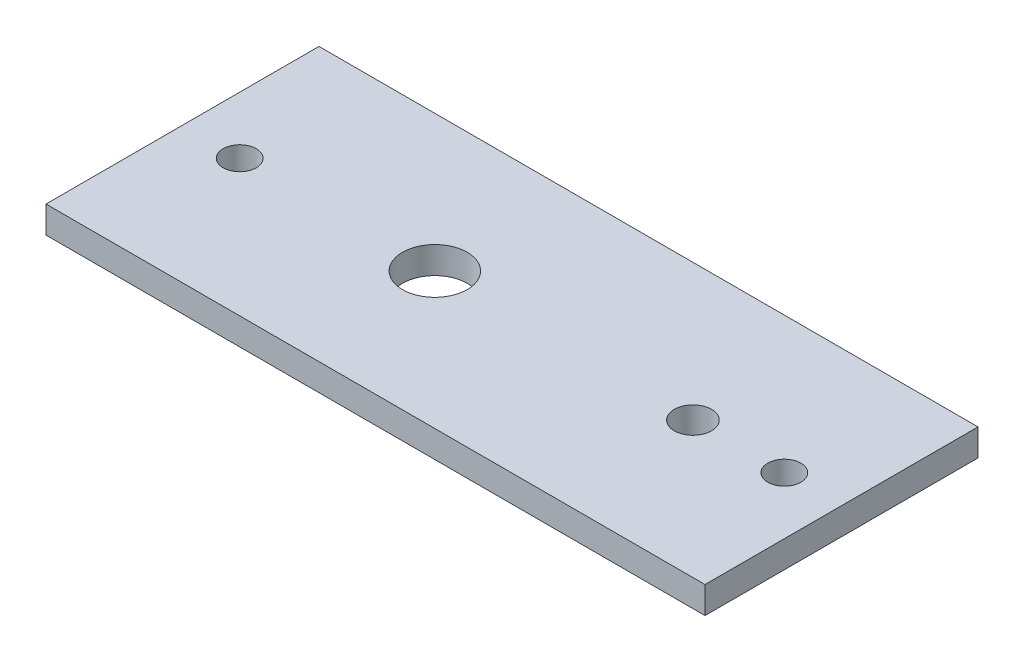
ISO-10303-21;
HEADER;
FILE_DESCRIPTION(('STEP AP214'),'2;1');
FILE_NAME('part.step','',(''),(''),'','','');
FILE_SCHEMA(('AUTOMOTIVE_DESIGN { 1 0 10303 214 1 1 1 1 }'));
ENDSEC;
DATA;
#1=APPLICATION_CONTEXT('core data for automotive mechanical design processes');
#2=APPLICATION_PROTOCOL_DEFINITION('international standard','automotive_design',2000,#1);
#3=PRODUCT_CONTEXT('',#1,'mechanical');
#4=PRODUCT('Part','Part','',(#3));
#5=PRODUCT_RELATED_PRODUCT_CATEGORY('part','',(#4));
#6=PRODUCT_DEFINITION_FORMATION('','',#4);
#7=PRODUCT_DEFINITION_CONTEXT('part definition',#1,'design');
#8=PRODUCT_DEFINITION('design','',#6,#7);
#9=PRODUCT_DEFINITION_SHAPE('','',#8);
#10=(LENGTH_UNIT() NAMED_UNIT(*) SI_UNIT(.MILLI.,.METRE.));
#11=(NAMED_UNIT(*) PLANE_ANGLE_UNIT() SI_UNIT($,.RADIAN.));
#12=(NAMED_UNIT(*) SI_UNIT($,.STERADIAN.) SOLID_ANGLE_UNIT());
#13=UNCERTAINTY_MEASURE_WITH_UNIT(LENGTH_MEASURE(1.E-05),#10,'distance_accuracy_value','');
#14=(GEOMETRIC_REPRESENTATION_CONTEXT(3) GLOBAL_UNCERTAINTY_ASSIGNED_CONTEXT((#13)) GLOBAL_UNIT_ASSIGNED_CONTEXT((#10,
#11,#12)) REPRESENTATION_CONTEXT('',''));
#15=CARTESIAN_POINT('',(0.,0.,0.));
#16=DIRECTION('',(0.,0.,1.));
#17=DIRECTION('',(1.,0.,0.));
#18=AXIS2_PLACEMENT_3D('',#15,#16,#17);
#19=CARTESIAN_POINT('',(0.,3.302,0.));
#20=DIRECTION('',(0.,1.,0.));
#21=DIRECTION('',(0.,0.,1.));
#22=AXIS2_PLACEMENT_3D('',#19,#20,#21);
#23=PLANE('',#22);
#24=CARTESIAN_POINT('',(-9.46150000000006,3.302,0.));
#25=DIRECTION('',(0.,1.,0.));
#26=DIRECTION('',(0.,0.,1.));
#27=AXIS2_PLACEMENT_3D('',#24,#25,#26);
#28=CIRCLE('',#27,3.96874999999455);
#29=CARTESIAN_POINT('',(-9.46150000000006,3.302,3.96874999999461));
#30=VERTEX_POINT('',#29);
#31=EDGE_CURVE('E130',#30,#30,#28,.F.);
#32=ORIENTED_EDGE('',*,*,#31,.T.);
#33=EDGE_LOOP('',(#32));
#34=FACE_BOUND('',#33,.T.);
#35=CARTESIAN_POINT('',(22.2091249999997,3.302,0.0161900786201999));
#36=DIRECTION('',(0.,1.,0.));
#37=DIRECTION('',(0.,0.,1.));
#38=AXIS2_PLACEMENT_3D('',#35,#36,#37);
#39=CIRCLE('',#38,2.286);
#40=CARTESIAN_POINT('',(22.2091249999997,3.302,2.3021900786202));
#41=VERTEX_POINT('',#40);
#42=EDGE_CURVE('E131',#41,#41,#39,.F.);
#43=ORIENTED_EDGE('',*,*,#42,.T.);
#44=EDGE_LOOP('',(#43));
#45=FACE_BOUND('',#44,.T.);
#46=CARTESIAN_POINT('',(-33.401,3.302,0.));
#47=DIRECTION('',(0.,1.,0.));
#48=DIRECTION('',(0.,0.,1.));
#49=AXIS2_PLACEMENT_3D('',#46,#47,#48);
#50=CIRCLE('',#49,2.03200000000001);
#51=CARTESIAN_POINT('',(-33.401,3.302,-2.03200000000001));
#52=VERTEX_POINT('',#51);
#53=EDGE_CURVE('E106',#52,#52,#50,.T.);
#54=ORIENTED_EDGE('',*,*,#53,.F.);
#55=EDGE_LOOP('',(#54));
#56=FACE_BOUND('',#55,.T.);
#57=DIRECTION('',(0.,0.,-1.));
#58=VECTOR('',#57,1.);
#59=CARTESIAN_POINT('',(40.4154656813443,3.302,-16.7415208054588));
#60=LINE('',#59,#58);
#61=CARTESIAN_POINT('',(40.4154656813443,3.302,16.7415208054588));
#62=VERTEX_POINT('',#61);
#63=CARTESIAN_POINT('',(40.4154656813443,3.302,-16.7415208054588));
#64=VERTEX_POINT('',#63);
#65=EDGE_CURVE('E93',#62,#64,#60,.T.);
#66=ORIENTED_EDGE('',*,*,#65,.T.);
#67=DIRECTION('',(-1.,0.,0.));
#68=VECTOR('',#67,1.);
#69=CARTESIAN_POINT('',(-40.4154656813443,3.302,-16.7415208054588));
#70=LINE('',#69,#68);
#71=CARTESIAN_POINT('',(-40.4154656813443,3.302,-16.7415208054588));
#72=VERTEX_POINT('',#71);
#73=EDGE_CURVE('E88',#64,#72,#70,.T.);
#74=ORIENTED_EDGE('',*,*,#73,.T.);
#75=DIRECTION('',(0.,0.,1.));
#76=VECTOR('',#75,1.);
#77=CARTESIAN_POINT('',(-40.4154656813443,3.302,-16.7415208054588));
#78=LINE('',#77,#76);
#79=CARTESIAN_POINT('',(-40.4154656813443,3.302,16.7415208054588));
#80=VERTEX_POINT('',#79);
#81=EDGE_CURVE('E90',#72,#80,#78,.T.);
#82=ORIENTED_EDGE('',*,*,#81,.T.);
#83=DIRECTION('',(1.,0.,0.));
#84=VECTOR('',#83,1.);
#85=CARTESIAN_POINT('',(-40.4154656813443,3.302,16.7415208054588));
#86=LINE('',#85,#84);
#87=EDGE_CURVE('E57',#80,#62,#86,.T.);
#88=ORIENTED_EDGE('',*,*,#87,.T.);
#89=EDGE_LOOP('',(#66,#74,#82,#88));
#90=FACE_BOUND('',#89,.T.);
#91=CARTESIAN_POINT('',(33.401,3.302,0.));
#92=DIRECTION('',(0.,1.,0.));
#93=DIRECTION('',(0.,0.,-1.));
#94=AXIS2_PLACEMENT_3D('',#91,#92,#93);
#95=CIRCLE('',#94,2.03200000000001);
#96=CARTESIAN_POINT('',(33.401,3.302,-2.03200000000002));
#97=VERTEX_POINT('',#96);
#98=EDGE_CURVE('E123',#97,#97,#95,.T.);
#99=ORIENTED_EDGE('',*,*,#98,.F.);
#100=EDGE_LOOP('',(#99));
#101=FACE_BOUND('',#100,.T.);
#102=ADVANCED_FACE('F39',(#34,#45,#56,#90,#101),#23,.T.);
#103=CARTESIAN_POINT('',(0.,0.,0.));
#104=DIRECTION('',(0.,1.,0.));
#105=DIRECTION('',(0.,0.,1.));
#106=AXIS2_PLACEMENT_3D('',#103,#104,#105);
#107=PLANE('',#106);
#108=CARTESIAN_POINT('',(-9.46150000000006,0.,0.));
#109=DIRECTION('',(0.,-1.,0.));
#110=DIRECTION('',(0.,0.,-1.));
#111=AXIS2_PLACEMENT_3D('',#108,#109,#110);
#112=CIRCLE('',#111,3.96874999999455);
#113=CARTESIAN_POINT('',(-9.46150000000006,0.,-3.96874999999449));
#114=VERTEX_POINT('',#113);
#115=EDGE_CURVE('E134',#114,#114,#112,.T.);
#116=ORIENTED_EDGE('',*,*,#115,.F.);
#117=EDGE_LOOP('',(#116));
#118=FACE_BOUND('',#117,.T.);
#119=CARTESIAN_POINT('',(22.2091249999997,0.,0.0161900786201999));
#120=DIRECTION('',(0.,-1.,0.));
#121=DIRECTION('',(0.,0.,-1.));
#122=AXIS2_PLACEMENT_3D('',#119,#120,#121);
#123=CIRCLE('',#122,2.286);
#124=CARTESIAN_POINT('',(22.2091249999997,0.,-2.2698099213798));
#125=VERTEX_POINT('',#124);
#126=EDGE_CURVE('E128',#125,#125,#123,.T.);
#127=ORIENTED_EDGE('',*,*,#126,.F.);
#128=EDGE_LOOP('',(#127));
#129=FACE_BOUND('',#128,.T.);
#130=DIRECTION('',(0.,0.,-1.));
#131=VECTOR('',#130,1.);
#132=CARTESIAN_POINT('',(40.4154656813443,0.,-16.7415208054588));
#133=LINE('',#132,#131);
#134=CARTESIAN_POINT('',(40.4154656813443,0.,16.7415208054588));
#135=VERTEX_POINT('',#134);
#136=CARTESIAN_POINT('',(40.4154656813443,0.,-16.7415208054588));
#137=VERTEX_POINT('',#136);
#138=EDGE_CURVE('E103',#135,#137,#133,.T.);
#139=ORIENTED_EDGE('',*,*,#138,.F.);
#140=DIRECTION('',(1.,0.,0.));
#141=VECTOR('',#140,1.);
#142=CARTESIAN_POINT('',(-40.4154656813443,0.,16.7415208054588));
#143=LINE('',#142,#141);
#144=CARTESIAN_POINT('',(-40.4154656813443,0.,16.7415208054588));
#145=VERTEX_POINT('',#144);
#146=EDGE_CURVE('E76',#145,#135,#143,.T.);
#147=ORIENTED_EDGE('',*,*,#146,.F.);
#148=DIRECTION('',(0.,0.,1.));
#149=VECTOR('',#148,1.);
#150=CARTESIAN_POINT('',(-40.4154656813443,0.,-16.7415208054588));
#151=LINE('',#150,#149);
#152=CARTESIAN_POINT('',(-40.4154656813443,0.,-16.7415208054588));
#153=VERTEX_POINT('',#152);
#154=EDGE_CURVE('E71',#153,#145,#151,.T.);
#155=ORIENTED_EDGE('',*,*,#154,.F.);
#156=DIRECTION('',(-1.,0.,0.));
#157=VECTOR('',#156,1.);
#158=CARTESIAN_POINT('',(-40.4154656813443,0.,-16.7415208054588));
#159=LINE('',#158,#157);
#160=EDGE_CURVE('E92',#137,#153,#159,.T.);
#161=ORIENTED_EDGE('',*,*,#160,.F.);
#162=EDGE_LOOP('',(#139,#147,#155,#161));
#163=FACE_BOUND('',#162,.T.);
#164=CARTESIAN_POINT('',(-33.401,0.,0.));
#165=DIRECTION('',(0.,1.,0.));
#166=DIRECTION('',(0.,0.,1.));
#167=AXIS2_PLACEMENT_3D('',#164,#165,#166);
#168=CIRCLE('',#167,2.03200000000001);
#169=CARTESIAN_POINT('',(-33.401,0.,-2.03200000000001));
#170=VERTEX_POINT('',#169);
#171=EDGE_CURVE('E119',#170,#170,#168,.T.);
#172=ORIENTED_EDGE('',*,*,#171,.T.);
#173=EDGE_LOOP('',(#172));
#174=FACE_BOUND('',#173,.T.);
#175=CARTESIAN_POINT('',(33.401,0.,0.));
#176=DIRECTION('',(0.,1.,0.));
#177=DIRECTION('',(0.,0.,-1.));
#178=AXIS2_PLACEMENT_3D('',#175,#176,#177);
#179=CIRCLE('',#178,2.03200000000001);
#180=CARTESIAN_POINT('',(33.401,0.,-2.03200000000002));
#181=VERTEX_POINT('',#180);
#182=EDGE_CURVE('E122',#181,#181,#179,.T.);
#183=ORIENTED_EDGE('',*,*,#182,.T.);
#184=EDGE_LOOP('',(#183));
#185=FACE_BOUND('',#184,.T.);
#186=ADVANCED_FACE('F111',(#118,#129,#163,#174,#185),#107,.F.);
#187=CARTESIAN_POINT('',(40.4154656813443,3.302,-16.7415208054588));
#188=DIRECTION('',(-1.,0.,0.));
#189=DIRECTION('',(0.,0.,1.));
#190=AXIS2_PLACEMENT_3D('',#187,#188,#189);
#191=PLANE('',#190);
#192=ORIENTED_EDGE('',*,*,#138,.T.);
#193=DIRECTION('',(0.,-1.,0.));
#194=VECTOR('',#193,1.);
#195=CARTESIAN_POINT('',(40.4154656813443,3.302,-16.7415208054588));
#196=LINE('',#195,#194);
#197=EDGE_CURVE('E11',#64,#137,#196,.T.);
#198=ORIENTED_EDGE('',*,*,#197,.F.);
#199=ORIENTED_EDGE('',*,*,#65,.F.);
#200=DIRECTION('',(0.,-1.,0.));
#201=VECTOR('',#200,1.);
#202=CARTESIAN_POINT('',(40.4154656813443,3.302,16.7415208054588));
#203=LINE('',#202,#201);
#204=EDGE_CURVE('E97',#62,#135,#203,.T.);
#205=ORIENTED_EDGE('',*,*,#204,.T.);
#206=EDGE_LOOP('',(#192,#198,#199,#205));
#207=FACE_BOUND('',#206,.T.);
#208=ADVANCED_FACE('F41',(#207),#191,.F.);
#209=CARTESIAN_POINT('',(-40.4154656813443,3.302,-16.7415208054588));
#210=DIRECTION('',(0.,0.,1.));
#211=DIRECTION('',(1.,0.,0.));
#212=AXIS2_PLACEMENT_3D('',#209,#210,#211);
#213=PLANE('',#212);
#214=ORIENTED_EDGE('',*,*,#160,.T.);
#215=DIRECTION('',(0.,-1.,0.));
#216=VECTOR('',#215,1.);
#217=CARTESIAN_POINT('',(-40.4154656813443,3.302,-16.7415208054588));
#218=LINE('',#217,#216);
#219=EDGE_CURVE('E48',#72,#153,#218,.T.);
#220=ORIENTED_EDGE('',*,*,#219,.F.);
#221=ORIENTED_EDGE('',*,*,#73,.F.);
#222=ORIENTED_EDGE('',*,*,#197,.T.);
#223=EDGE_LOOP('',(#214,#220,#221,#222));
#224=FACE_BOUND('',#223,.T.);
#225=ADVANCED_FACE('F94',(#224),#213,.F.);
#226=CARTESIAN_POINT('',(-40.4154656813443,3.302,-16.7415208054588));
#227=DIRECTION('',(1.,0.,0.));
#228=DIRECTION('',(0.,0.,-1.));
#229=AXIS2_PLACEMENT_3D('',#226,#227,#228);
#230=PLANE('',#229);
#231=ORIENTED_EDGE('',*,*,#154,.T.);
#232=DIRECTION('',(0.,-1.,0.));
#233=VECTOR('',#232,1.);
#234=CARTESIAN_POINT('',(-40.4154656813443,3.302,16.7415208054588));
#235=LINE('',#234,#233);
#236=EDGE_CURVE('E96',#80,#145,#235,.T.);
#237=ORIENTED_EDGE('',*,*,#236,.F.);
#238=ORIENTED_EDGE('',*,*,#81,.F.);
#239=ORIENTED_EDGE('',*,*,#219,.T.);
#240=EDGE_LOOP('',(#231,#237,#238,#239));
#241=FACE_BOUND('',#240,.T.);
#242=ADVANCED_FACE('F100',(#241),#230,.F.);
#243=CARTESIAN_POINT('',(-40.4154656813443,3.302,16.7415208054588));
#244=DIRECTION('',(0.,0.,-1.));
#245=DIRECTION('',(-1.,0.,0.));
#246=AXIS2_PLACEMENT_3D('',#243,#244,#245);
#247=PLANE('',#246);
#248=ORIENTED_EDGE('',*,*,#146,.T.);
#249=ORIENTED_EDGE('',*,*,#204,.F.);
#250=ORIENTED_EDGE('',*,*,#87,.F.);
#251=ORIENTED_EDGE('',*,*,#236,.T.);
#252=EDGE_LOOP('',(#248,#249,#250,#251));
#253=FACE_BOUND('',#252,.T.);
#254=ADVANCED_FACE('F112',(#253),#247,.F.);
#255=CARTESIAN_POINT('',(-33.401,3.302,0.));
#256=DIRECTION('',(0.,-1.,0.));
#257=DIRECTION('',(0.,0.,-1.));
#258=AXIS2_PLACEMENT_3D('',#255,#256,#257);
#259=CYLINDRICAL_SURFACE('',#258,2.03200000000001);
#260=CARTESIAN_POINT('',(-33.401,3.302,-2.03200000000001));
#261=CARTESIAN_POINT('',(-33.401,3.26760416666667,-2.03200000000001));
#262=CARTESIAN_POINT('',(-33.401,3.23320833333333,-2.03200000000001));
#263=CARTESIAN_POINT('',(-33.401,3.16441666666667,-2.03200000000001));
#264=CARTESIAN_POINT('',(-33.401,3.13002083333333,-2.03200000000001));
#265=CARTESIAN_POINT('',(-33.401,3.06122916666667,-2.03200000000001));
#266=CARTESIAN_POINT('',(-33.401,3.02683333333333,-2.03200000000001));
#267=CARTESIAN_POINT('',(-33.401,2.95804166666667,-2.03200000000001));
#268=CARTESIAN_POINT('',(-33.401,2.92364583333333,-2.03200000000001));
#269=CARTESIAN_POINT('',(-33.401,2.85485416666667,-2.03200000000001));
#270=CARTESIAN_POINT('',(-33.401,2.82045833333333,-2.03200000000001));
#271=CARTESIAN_POINT('',(-33.401,2.75166666666667,-2.03200000000001));
#272=CARTESIAN_POINT('',(-33.401,2.71727083333333,-2.03200000000001));
#273=CARTESIAN_POINT('',(-33.401,2.64847916666667,-2.03200000000001));
#274=CARTESIAN_POINT('',(-33.401,2.61408333333333,-2.03200000000001));
#275=CARTESIAN_POINT('',(-33.401,2.54529166666667,-2.03200000000001));
#276=CARTESIAN_POINT('',(-33.401,2.51089583333333,-2.03200000000001));
#277=CARTESIAN_POINT('',(-33.401,2.44210416666667,-2.03200000000001));
#278=CARTESIAN_POINT('',(-33.401,2.40770833333333,-2.03200000000001));
#279=CARTESIAN_POINT('',(-33.401,2.33891666666667,-2.03200000000001));
#280=CARTESIAN_POINT('',(-33.401,2.30452083333333,-2.03200000000001));
#281=CARTESIAN_POINT('',(-33.401,2.23572916666667,-2.03200000000001));
#282=CARTESIAN_POINT('',(-33.401,2.20133333333333,-2.03200000000001));
#283=CARTESIAN_POINT('',(-33.401,2.13254166666667,-2.03200000000001));
#284=CARTESIAN_POINT('',(-33.401,2.09814583333333,-2.03200000000001));
#285=CARTESIAN_POINT('',(-33.401,2.02935416666667,-2.03200000000001));
#286=CARTESIAN_POINT('',(-33.401,1.99495833333333,-2.03200000000001));
#287=CARTESIAN_POINT('',(-33.401,1.92616666666667,-2.03200000000001));
#288=CARTESIAN_POINT('',(-33.401,1.89177083333333,-2.03200000000001));
#289=CARTESIAN_POINT('',(-33.401,1.82297916666667,-2.03200000000001));
#290=CARTESIAN_POINT('',(-33.401,1.78858333333333,-2.03200000000001));
#291=CARTESIAN_POINT('',(-33.401,1.71979166666667,-2.03200000000001));
#292=CARTESIAN_POINT('',(-33.401,1.68539583333333,-2.03200000000001));
#293=CARTESIAN_POINT('',(-33.401,1.61660416666667,-2.03200000000001));
#294=CARTESIAN_POINT('',(-33.401,1.58220833333333,-2.03200000000001));
#295=CARTESIAN_POINT('',(-33.401,1.51341666666667,-2.03200000000001));
#296=CARTESIAN_POINT('',(-33.401,1.47902083333333,-2.03200000000001));
#297=CARTESIAN_POINT('',(-33.401,1.41022916666667,-2.03200000000001));
#298=CARTESIAN_POINT('',(-33.401,1.37583333333333,-2.03200000000001));
#299=CARTESIAN_POINT('',(-33.401,1.30704166666667,-2.03200000000001));
#300=CARTESIAN_POINT('',(-33.401,1.27264583333333,-2.03200000000001));
#301=CARTESIAN_POINT('',(-33.401,1.20385416666667,-2.03200000000001));
#302=CARTESIAN_POINT('',(-33.401,1.16945833333333,-2.03200000000001));
#303=CARTESIAN_POINT('',(-33.401,1.10066666666667,-2.03200000000001));
#304=CARTESIAN_POINT('',(-33.401,1.06627083333333,-2.03200000000001));
#305=CARTESIAN_POINT('',(-33.401,0.997479166666666,-2.03200000000001));
#306=CARTESIAN_POINT('',(-33.401,0.963083333333333,-2.03200000000001));
#307=CARTESIAN_POINT('',(-33.401,0.894291666666666,-2.03200000000001));
#308=CARTESIAN_POINT('',(-33.401,0.859895833333333,-2.03200000000001));
#309=CARTESIAN_POINT('',(-33.401,0.791104166666666,-2.03200000000001));
#310=CARTESIAN_POINT('',(-33.401,0.756708333333333,-2.03200000000001));
#311=CARTESIAN_POINT('',(-33.401,0.687916666666667,-2.03200000000001));
#312=CARTESIAN_POINT('',(-33.401,0.653520833333333,-2.03200000000001));
#313=CARTESIAN_POINT('',(-33.401,0.584729166666667,-2.03200000000001));
#314=CARTESIAN_POINT('',(-33.401,0.550333333333333,-2.03200000000001));
#315=CARTESIAN_POINT('',(-33.401,0.481541666666667,-2.03200000000001));
#316=CARTESIAN_POINT('',(-33.401,0.447145833333333,-2.03200000000001));
#317=CARTESIAN_POINT('',(-33.401,0.378354166666667,-2.03200000000001));
#318=CARTESIAN_POINT('',(-33.401,0.343958333333333,-2.03200000000001));
#319=CARTESIAN_POINT('',(-33.401,0.275166666666667,-2.03200000000001));
#320=CARTESIAN_POINT('',(-33.401,0.240770833333333,-2.03200000000001));
#321=CARTESIAN_POINT('',(-33.401,0.171979166666667,-2.03200000000001));
#322=CARTESIAN_POINT('',(-33.401,0.137583333333333,-2.03200000000001));
#323=CARTESIAN_POINT('',(-33.401,0.0687916666666666,-2.03200000000001));
#324=CARTESIAN_POINT('',(-33.401,0.0343958333333333,-2.03200000000001));
#325=CARTESIAN_POINT('',(-33.401,0.,-2.03200000000001));
#326=B_SPLINE_CURVE_WITH_KNOTS('',3,(#260,#261,#262,#263,#264,#265,#266,#267,#268,#269,#270,
#271,#272,#273,#274,#275,#276,#277,#278,#279,#280,#281,#282,#283,#284,#285,#286,#287,#288,#289,
#290,#291,#292,#293,#294,#295,#296,#297,#298,#299,#300,#301,#302,#303,#304,#305,#306,#307,#308,
#309,#310,#311,#312,#313,#314,#315,#316,#317,#318,#319,#320,#321,#322,#323,#324,#325),
.UNSPECIFIED.,.F.,.F.,(4,2,2,2,2,2,2,2,2,2,2,2,2,2,2,2,2,2,2,2,2,2,2,2,2,2,2,2,2,2,2,2,4),(0.,
0.1031875,0.206375,0.3095625,0.41275,0.5159375,0.619125,0.7223125,0.8255,0.9286875,1.031875,
1.1350625,1.23825,1.3414375,1.444625,1.5478125,1.651,1.7541875,1.857375,1.9605625,2.06375,
2.1669375,2.270125,2.3733125,2.4765,2.5796875,2.682875,2.7860625,2.88925,2.9924375,3.095625,
3.1988125,3.302),.UNSPECIFIED.);
#327=EDGE_CURVE('BSEAM162',#52,#170,#326,.T.);
#328=ORIENTED_EDGE('',*,*,#53,.T.);
#329=ORIENTED_EDGE('',*,*,#171,.F.);
#330=ORIENTED_EDGE('',*,*,#327,.T.);
#331=ORIENTED_EDGE('',*,*,#327,.F.);
#332=EDGE_LOOP('',(#328,#330,#329,#331));
#333=FACE_BOUND('',#332,.T.);
#334=ADVANCED_FACE('F162',(#333),#259,.F.);
#335=CARTESIAN_POINT('',(33.401,3.302,0.));
#336=DIRECTION('',(0.,-1.,0.));
#337=DIRECTION('',(0.,0.,-1.));
#338=AXIS2_PLACEMENT_3D('',#335,#336,#337);
#339=CYLINDRICAL_SURFACE('',#338,2.03200000000001);
#340=CARTESIAN_POINT('',(33.401,3.302,-2.03200000000002));
#341=CARTESIAN_POINT('',(33.401,3.26760416666667,-2.03200000000002));
#342=CARTESIAN_POINT('',(33.401,3.23320833333333,-2.03200000000002));
#343=CARTESIAN_POINT('',(33.401,3.16441666666667,-2.03200000000002));
#344=CARTESIAN_POINT('',(33.401,3.13002083333333,-2.03200000000002));
#345=CARTESIAN_POINT('',(33.401,3.06122916666667,-2.03200000000002));
#346=CARTESIAN_POINT('',(33.401,3.02683333333333,-2.03200000000002));
#347=CARTESIAN_POINT('',(33.401,2.95804166666667,-2.03200000000002));
#348=CARTESIAN_POINT('',(33.401,2.92364583333333,-2.03200000000002));
#349=CARTESIAN_POINT('',(33.401,2.85485416666667,-2.03200000000002));
#350=CARTESIAN_POINT('',(33.401,2.82045833333333,-2.03200000000002));
#351=CARTESIAN_POINT('',(33.401,2.75166666666667,-2.03200000000002));
#352=CARTESIAN_POINT('',(33.401,2.71727083333333,-2.03200000000002));
#353=CARTESIAN_POINT('',(33.401,2.64847916666667,-2.03200000000002));
#354=CARTESIAN_POINT('',(33.401,2.61408333333333,-2.03200000000002));
#355=CARTESIAN_POINT('',(33.401,2.54529166666667,-2.03200000000002));
#356=CARTESIAN_POINT('',(33.401,2.51089583333333,-2.03200000000002));
#357=CARTESIAN_POINT('',(33.401,2.44210416666667,-2.03200000000002));
#358=CARTESIAN_POINT('',(33.401,2.40770833333333,-2.03200000000002));
#359=CARTESIAN_POINT('',(33.401,2.33891666666667,-2.03200000000002));
#360=CARTESIAN_POINT('',(33.401,2.30452083333333,-2.03200000000002));
#361=CARTESIAN_POINT('',(33.401,2.23572916666667,-2.03200000000002));
#362=CARTESIAN_POINT('',(33.401,2.20133333333333,-2.03200000000002));
#363=CARTESIAN_POINT('',(33.401,2.13254166666667,-2.03200000000002));
#364=CARTESIAN_POINT('',(33.401,2.09814583333333,-2.03200000000002));
#365=CARTESIAN_POINT('',(33.401,2.02935416666667,-2.03200000000002));
#366=CARTESIAN_POINT('',(33.401,1.99495833333333,-2.03200000000002));
#367=CARTESIAN_POINT('',(33.401,1.92616666666667,-2.03200000000002));
#368=CARTESIAN_POINT('',(33.401,1.89177083333333,-2.03200000000002));
#369=CARTESIAN_POINT('',(33.401,1.82297916666667,-2.03200000000002));
#370=CARTESIAN_POINT('',(33.401,1.78858333333333,-2.03200000000002));
#371=CARTESIAN_POINT('',(33.401,1.71979166666667,-2.03200000000002));
#372=CARTESIAN_POINT('',(33.401,1.68539583333333,-2.03200000000002));
#373=CARTESIAN_POINT('',(33.401,1.61660416666667,-2.03200000000002));
#374=CARTESIAN_POINT('',(33.401,1.58220833333333,-2.03200000000002));
#375=CARTESIAN_POINT('',(33.401,1.51341666666667,-2.03200000000002));
#376=CARTESIAN_POINT('',(33.401,1.47902083333333,-2.03200000000002));
#377=CARTESIAN_POINT('',(33.401,1.41022916666667,-2.03200000000002));
#378=CARTESIAN_POINT('',(33.401,1.37583333333333,-2.03200000000002));
#379=CARTESIAN_POINT('',(33.401,1.30704166666667,-2.03200000000002));
#380=CARTESIAN_POINT('',(33.401,1.27264583333333,-2.03200000000002));
#381=CARTESIAN_POINT('',(33.401,1.20385416666667,-2.03200000000002));
#382=CARTESIAN_POINT('',(33.401,1.16945833333333,-2.03200000000002));
#383=CARTESIAN_POINT('',(33.401,1.10066666666667,-2.03200000000002));
#384=CARTESIAN_POINT('',(33.401,1.06627083333333,-2.03200000000002));
#385=CARTESIAN_POINT('',(33.401,0.997479166666666,-2.03200000000002));
#386=CARTESIAN_POINT('',(33.401,0.963083333333333,-2.03200000000002));
#387=CARTESIAN_POINT('',(33.401,0.894291666666666,-2.03200000000002));
#388=CARTESIAN_POINT('',(33.401,0.859895833333333,-2.03200000000002));
#389=CARTESIAN_POINT('',(33.401,0.791104166666666,-2.03200000000002));
#390=CARTESIAN_POINT('',(33.401,0.756708333333333,-2.03200000000002));
#391=CARTESIAN_POINT('',(33.401,0.687916666666667,-2.03200000000002));
#392=CARTESIAN_POINT('',(33.401,0.653520833333333,-2.03200000000002));
#393=CARTESIAN_POINT('',(33.401,0.584729166666667,-2.03200000000002));
#394=CARTESIAN_POINT('',(33.401,0.550333333333333,-2.03200000000002));
#395=CARTESIAN_POINT('',(33.401,0.481541666666667,-2.03200000000002));
#396=CARTESIAN_POINT('',(33.401,0.447145833333333,-2.03200000000002));
#397=CARTESIAN_POINT('',(33.401,0.378354166666667,-2.03200000000002));
#398=CARTESIAN_POINT('',(33.401,0.343958333333333,-2.03200000000002));
#399=CARTESIAN_POINT('',(33.401,0.275166666666667,-2.03200000000002));
#400=CARTESIAN_POINT('',(33.401,0.240770833333333,-2.03200000000002));
#401=CARTESIAN_POINT('',(33.401,0.171979166666667,-2.03200000000002));
#402=CARTESIAN_POINT('',(33.401,0.137583333333333,-2.03200000000002));
#403=CARTESIAN_POINT('',(33.401,0.0687916666666666,-2.03200000000002));
#404=CARTESIAN_POINT('',(33.401,0.0343958333333333,-2.03200000000002));
#405=CARTESIAN_POINT('',(33.401,0.,-2.03200000000002));
#406=B_SPLINE_CURVE_WITH_KNOTS('',3,(#340,#341,#342,#343,#344,#345,#346,#347,#348,#349,#350,
#351,#352,#353,#354,#355,#356,#357,#358,#359,#360,#361,#362,#363,#364,#365,#366,#367,#368,#369,
#370,#371,#372,#373,#374,#375,#376,#377,#378,#379,#380,#381,#382,#383,#384,#385,#386,#387,#388,
#389,#390,#391,#392,#393,#394,#395,#396,#397,#398,#399,#400,#401,#402,#403,#404,#405),
.UNSPECIFIED.,.F.,.F.,(4,2,2,2,2,2,2,2,2,2,2,2,2,2,2,2,2,2,2,2,2,2,2,2,2,2,2,2,2,2,2,2,4),(0.,
0.1031875,0.206375,0.3095625,0.41275,0.5159375,0.619125,0.7223125,0.8255,0.9286875,1.031875,
1.1350625,1.23825,1.3414375,1.444625,1.5478125,1.651,1.7541875,1.857375,1.9605625,2.06375,
2.1669375,2.270125,2.3733125,2.4765,2.5796875,2.682875,2.7860625,2.88925,2.9924375,3.095625,
3.1988125,3.302),.UNSPECIFIED.);
#407=EDGE_CURVE('BSEAM153',#97,#181,#406,.T.);
#408=ORIENTED_EDGE('',*,*,#98,.T.);
#409=ORIENTED_EDGE('',*,*,#182,.F.);
#410=ORIENTED_EDGE('',*,*,#407,.T.);
#411=ORIENTED_EDGE('',*,*,#407,.F.);
#412=EDGE_LOOP('',(#408,#410,#409,#411));
#413=FACE_BOUND('',#412,.T.);
#414=ADVANCED_FACE('F153',(#413),#339,.F.);
#415=CARTESIAN_POINT('',(22.2091249999997,14.527320151321,0.0161900786201999));
#416=DIRECTION('',(0.,-1.,0.));
#417=DIRECTION('',(0.,0.,-1.));
#418=AXIS2_PLACEMENT_3D('',#415,#416,#417);
#419=CYLINDRICAL_SURFACE('',#418,2.286);
#420=ORIENTED_EDGE('',*,*,#126,.T.);
#421=EDGE_LOOP('',(#420));
#422=FACE_BOUND('',#421,.T.);
#423=ORIENTED_EDGE('',*,*,#42,.F.);
#424=EDGE_LOOP('',(#423));
#425=FACE_BOUND('',#424,.T.);
#426=ADVANCED_FACE('F147',(#422,#425),#419,.F.);
#427=CARTESIAN_POINT('',(-9.46150000000006,14.527320151321,0.));
#428=DIRECTION('',(0.,-1.,0.));
#429=DIRECTION('',(0.,0.,-1.));
#430=AXIS2_PLACEMENT_3D('',#427,#428,#429);
#431=CYLINDRICAL_SURFACE('',#430,3.96874999999455);
#432=ORIENTED_EDGE('',*,*,#115,.T.);
#433=EDGE_LOOP('',(#432));
#434=FACE_BOUND('',#433,.T.);
#435=ORIENTED_EDGE('',*,*,#31,.F.);
#436=EDGE_LOOP('',(#435));
#437=FACE_BOUND('',#436,.T.);
#438=ADVANCED_FACE('F142',(#434,#437),#431,.F.);
#439=CLOSED_SHELL('',(#102,#186,#208,#225,#242,#254,#334,#414,#426,#438));
#440=MANIFOLD_SOLID_BREP('B2',#439);
#441=ADVANCED_BREP_SHAPE_REPRESENTATION('',(#18,#440),#14);
#442=SHAPE_DEFINITION_REPRESENTATION(#9,#441);
ENDSEC;
END-ISO-10303-21;
